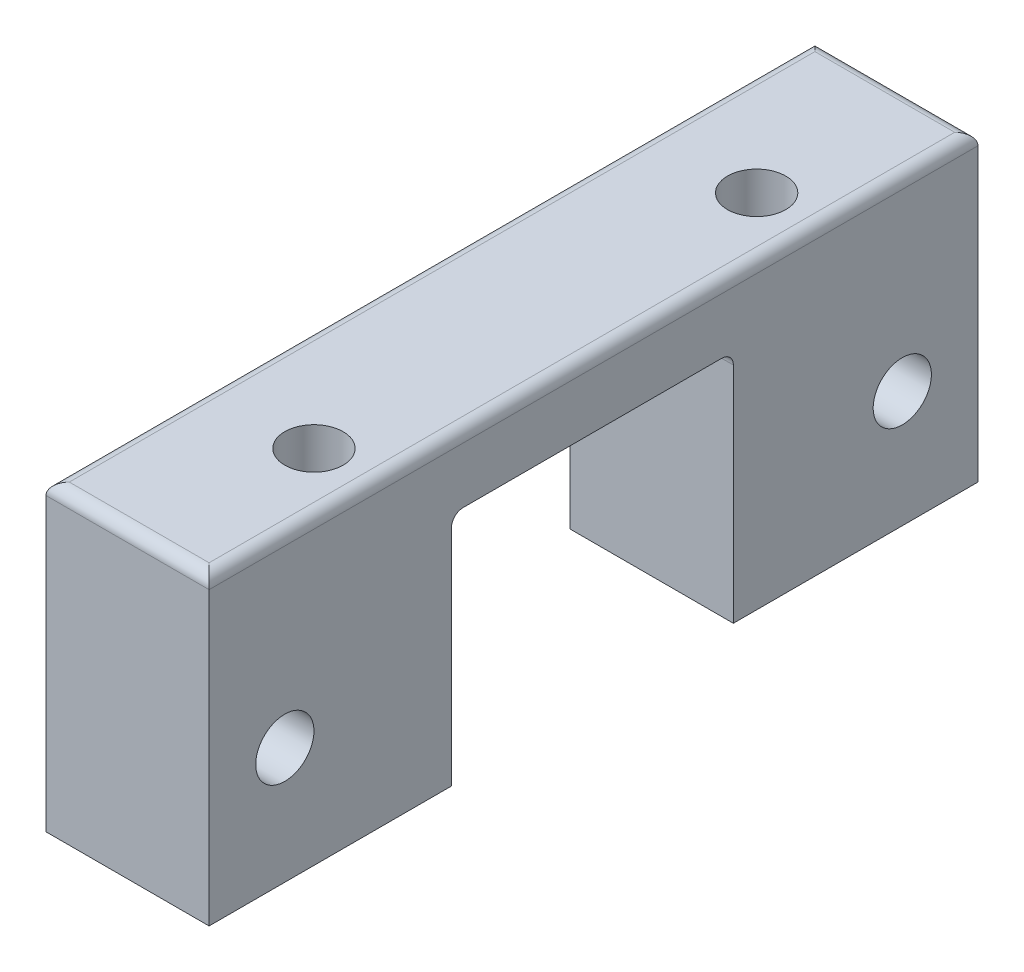
ISO-10303-21;
HEADER;
FILE_DESCRIPTION(('STEP AP214'),'2;1');
FILE_NAME('part.step','',(''),(''),'','','');
FILE_SCHEMA(('AUTOMOTIVE_DESIGN { 1 0 10303 214 1 1 1 1 }'));
ENDSEC;
DATA;
#1=APPLICATION_CONTEXT('core data for automotive mechanical design processes');
#2=APPLICATION_PROTOCOL_DEFINITION('international standard','automotive_design',2000,#1);
#3=PRODUCT_CONTEXT('',#1,'mechanical');
#4=PRODUCT('Part','Part','',(#3));
#5=PRODUCT_RELATED_PRODUCT_CATEGORY('part','',(#4));
#6=PRODUCT_DEFINITION_FORMATION('','',#4);
#7=PRODUCT_DEFINITION_CONTEXT('part definition',#1,'design');
#8=PRODUCT_DEFINITION('design','',#6,#7);
#9=PRODUCT_DEFINITION_SHAPE('','',#8);
#10=(LENGTH_UNIT() NAMED_UNIT(*) SI_UNIT(.MILLI.,.METRE.));
#11=(NAMED_UNIT(*) PLANE_ANGLE_UNIT() SI_UNIT($,.RADIAN.));
#12=(NAMED_UNIT(*) SI_UNIT($,.STERADIAN.) SOLID_ANGLE_UNIT());
#13=UNCERTAINTY_MEASURE_WITH_UNIT(LENGTH_MEASURE(1.E-05),#10,'distance_accuracy_value','');
#14=(GEOMETRIC_REPRESENTATION_CONTEXT(3) GLOBAL_UNCERTAINTY_ASSIGNED_CONTEXT((#13)) GLOBAL_UNIT_ASSIGNED_CONTEXT((#10,
#11,#12)) REPRESENTATION_CONTEXT('',''));
#15=CARTESIAN_POINT('',(0.,0.,0.));
#16=DIRECTION('',(0.,0.,1.));
#17=DIRECTION('',(1.,0.,0.));
#18=AXIS2_PLACEMENT_3D('',#15,#16,#17);
#19=CARTESIAN_POINT('',(0.,0.,0.));
#20=DIRECTION('',(0.,1.,0.));
#21=DIRECTION('',(0.,0.,1.));
#22=AXIS2_PLACEMENT_3D('',#19,#20,#21);
#23=PLANE('',#22);
#24=CARTESIAN_POINT('',(1.,0.,-9.5));
#25=DIRECTION('',(0.,1.,0.));
#26=DIRECTION('',(0.,0.,1.));
#27=AXIS2_PLACEMENT_3D('',#24,#25,#26);
#28=CIRCLE('',#27,1.25);
#29=CARTESIAN_POINT('',(1.,0.,-8.25));
#30=VERTEX_POINT('',#29);
#31=EDGE_CURVE('E200',#30,#30,#28,.T.);
#32=ORIENTED_EDGE('',*,*,#31,.T.);
#33=EDGE_LOOP('',(#32));
#34=FACE_BOUND('',#33,.T.);
#35=DIRECTION('',(0.,0.,-1.));
#36=VECTOR('',#35,1.);
#37=CARTESIAN_POINT('',(3.5,0.,16.5));
#38=LINE('',#37,#36);
#39=CARTESIAN_POINT('',(3.5,0.,-5.99999999999999));
#40=VERTEX_POINT('',#39);
#41=CARTESIAN_POINT('',(3.5,0.,-16.5));
#42=VERTEX_POINT('',#41);
#43=EDGE_CURVE('E131',#40,#42,#38,.T.);
#44=ORIENTED_EDGE('',*,*,#43,.F.);
#45=DIRECTION('',(-1.,0.,0.));
#46=VECTOR('',#45,1.);
#47=CARTESIAN_POINT('',(3.5,0.,-5.99999999999999));
#48=LINE('',#47,#46);
#49=CARTESIAN_POINT('',(-3.5,0.,-5.99999999999999));
#50=VERTEX_POINT('',#49);
#51=EDGE_CURVE('E143',#40,#50,#48,.T.);
#52=ORIENTED_EDGE('',*,*,#51,.T.);
#53=DIRECTION('',(0.,0.,-1.));
#54=VECTOR('',#53,1.);
#55=CARTESIAN_POINT('',(-3.5,0.,16.5));
#56=LINE('',#55,#54);
#57=CARTESIAN_POINT('',(-3.5,0.,-16.5));
#58=VERTEX_POINT('',#57);
#59=EDGE_CURVE('E165',#50,#58,#56,.T.);
#60=ORIENTED_EDGE('',*,*,#59,.T.);
#61=DIRECTION('',(1.,0.,0.));
#62=VECTOR('',#61,1.);
#63=CARTESIAN_POINT('',(-3.5,0.,-16.5));
#64=LINE('',#63,#62);
#65=EDGE_CURVE('E154',#58,#42,#64,.T.);
#66=ORIENTED_EDGE('',*,*,#65,.T.);
#67=EDGE_LOOP('',(#44,#52,#60,#66));
#68=FACE_BOUND('',#67,.T.);
#69=ADVANCED_FACE('F39',(#34,#68),#23,.F.);
#70=CARTESIAN_POINT('',(0.,13.,0.));
#71=DIRECTION('',(0.,1.,0.));
#72=DIRECTION('',(0.,0.,1.));
#73=AXIS2_PLACEMENT_3D('',#70,#71,#72);
#74=PLANE('',#73);
#75=CARTESIAN_POINT('',(1.,13.,9.5));
#76=DIRECTION('',(0.,-1.,0.));
#77=DIRECTION('',(0.,0.,-1.));
#78=AXIS2_PLACEMENT_3D('',#75,#76,#77);
#79=CIRCLE('',#78,1.25);
#80=CARTESIAN_POINT('',(1.,13.,10.75));
#81=VERTEX_POINT('',#80);
#82=EDGE_CURVE('E269',#81,#81,#79,.T.);
#83=ORIENTED_EDGE('',*,*,#82,.T.);
#84=EDGE_LOOP('',(#83));
#85=FACE_BOUND('',#84,.T.);
#86=DIRECTION('',(1.,0.,0.));
#87=VECTOR('',#86,1.);
#88=CARTESIAN_POINT('',(3.5,13.,16.));
#89=LINE('',#88,#87);
#90=CARTESIAN_POINT('',(-3.,13.,16.));
#91=VERTEX_POINT('',#90);
#92=CARTESIAN_POINT('',(3.,13.,16.));
#93=VERTEX_POINT('',#92);
#94=EDGE_CURVE('E182',#91,#93,#89,.T.);
#95=ORIENTED_EDGE('',*,*,#94,.T.);
#96=DIRECTION('',(0.,0.,-1.));
#97=VECTOR('',#96,1.);
#98=CARTESIAN_POINT('',(3.,13.,-16.5));
#99=LINE('',#98,#97);
#100=CARTESIAN_POINT('',(3.,13.,-16.));
#101=VERTEX_POINT('',#100);
#102=EDGE_CURVE('E185',#93,#101,#99,.T.);
#103=ORIENTED_EDGE('',*,*,#102,.T.);
#104=DIRECTION('',(1.,0.,0.));
#105=VECTOR('',#104,1.);
#106=CARTESIAN_POINT('',(0.,13.,-16.));
#107=LINE('',#106,#105);
#108=CARTESIAN_POINT('',(-3.,13.,-16.));
#109=VERTEX_POINT('',#108);
#110=EDGE_CURVE('E180',#101,#109,#107,.F.);
#111=ORIENTED_EDGE('',*,*,#110,.T.);
#112=DIRECTION('',(0.,0.,-1.));
#113=VECTOR('',#112,1.);
#114=CARTESIAN_POINT('',(-3.,13.,0.));
#115=LINE('',#114,#113);
#116=EDGE_CURVE('E173',#109,#91,#115,.F.);
#117=ORIENTED_EDGE('',*,*,#116,.T.);
#118=EDGE_LOOP('',(#95,#103,#111,#117));
#119=FACE_BOUND('',#118,.T.);
#120=CARTESIAN_POINT('',(1.,13.,-9.5));
#121=DIRECTION('',(0.,1.,0.));
#122=DIRECTION('',(0.,0.,1.));
#123=AXIS2_PLACEMENT_3D('',#120,#121,#122);
#124=CIRCLE('',#123,1.25);
#125=CARTESIAN_POINT('',(1.,13.,-8.25));
#126=VERTEX_POINT('',#125);
#127=EDGE_CURVE('E271',#126,#126,#124,.T.);
#128=ORIENTED_EDGE('',*,*,#127,.F.);
#129=EDGE_LOOP('',(#128));
#130=FACE_BOUND('',#129,.T.);
#131=ADVANCED_FACE('F240',(#85,#119,#130),#74,.T.);
#132=CARTESIAN_POINT('',(-3.5,0.,16.5));
#133=VERTEX_POINT('',#132);
#134=CARTESIAN_POINT('',(-3.5,0.,6.10000000000001));
#135=VERTEX_POINT('',#134);
#136=EDGE_CURVE('E166',#133,#135,#56,.T.);
#137=ORIENTED_EDGE('',*,*,#136,.T.);
#138=DIRECTION('',(-1.,0.,0.));
#139=VECTOR('',#138,1.);
#140=CARTESIAN_POINT('',(3.5,0.,6.10000000000001));
#141=LINE('',#140,#139);
#142=CARTESIAN_POINT('',(3.5,0.,6.10000000000001));
#143=VERTEX_POINT('',#142);
#144=EDGE_CURVE('E149',#143,#135,#141,.T.);
#145=ORIENTED_EDGE('',*,*,#144,.F.);
#146=CARTESIAN_POINT('',(3.5,0.,16.5));
#147=VERTEX_POINT('',#146);
#148=EDGE_CURVE('E155',#147,#143,#38,.T.);
#149=ORIENTED_EDGE('',*,*,#148,.F.);
#150=DIRECTION('',(1.,0.,0.));
#151=VECTOR('',#150,1.);
#152=CARTESIAN_POINT('',(-3.5,0.,16.5));
#153=LINE('',#152,#151);
#154=EDGE_CURVE('E158',#133,#147,#153,.T.);
#155=ORIENTED_EDGE('',*,*,#154,.F.);
#156=EDGE_LOOP('',(#137,#145,#149,#155));
#157=FACE_BOUND('',#156,.T.);
#158=CARTESIAN_POINT('',(1.,0.,9.5));
#159=DIRECTION('',(0.,-1.,0.));
#160=DIRECTION('',(0.,0.,-1.));
#161=AXIS2_PLACEMENT_3D('',#158,#159,#160);
#162=CIRCLE('',#161,1.25);
#163=CARTESIAN_POINT('',(1.,0.,10.75));
#164=VERTEX_POINT('',#163);
#165=EDGE_CURVE('E267',#164,#164,#162,.T.);
#166=ORIENTED_EDGE('',*,*,#165,.F.);
#167=EDGE_LOOP('',(#166));
#168=FACE_BOUND('',#167,.T.);
#169=ADVANCED_FACE('F243',(#157,#168),#23,.F.);
#170=CARTESIAN_POINT('',(-3.5,13.,-16.5));
#171=DIRECTION('',(0.,0.,-1.));
#172=DIRECTION('',(-1.,0.,0.));
#173=AXIS2_PLACEMENT_3D('',#170,#171,#172);
#174=PLANE('',#173);
#175=DIRECTION('',(0.,-1.,0.));
#176=VECTOR('',#175,1.);
#177=CARTESIAN_POINT('',(-3.5,13.,-16.5));
#178=LINE('',#177,#176);
#179=CARTESIAN_POINT('',(-3.5,12.5,-16.5));
#180=VERTEX_POINT('',#179);
#181=EDGE_CURVE('E170',#180,#58,#178,.T.);
#182=ORIENTED_EDGE('',*,*,#181,.F.);
#183=DIRECTION('',(1.,0.,0.));
#184=VECTOR('',#183,1.);
#185=CARTESIAN_POINT('',(-3.5,12.5,-16.5));
#186=LINE('',#185,#184);
#187=CARTESIAN_POINT('',(3.5,12.5,-16.5));
#188=VERTEX_POINT('',#187);
#189=EDGE_CURVE('E190',#180,#188,#186,.T.);
#190=ORIENTED_EDGE('',*,*,#189,.T.);
#191=DIRECTION('',(0.,-1.,0.));
#192=VECTOR('',#191,1.);
#193=CARTESIAN_POINT('',(3.5,13.,-16.5));
#194=LINE('',#193,#192);
#195=EDGE_CURVE('E169',#188,#42,#194,.T.);
#196=ORIENTED_EDGE('',*,*,#195,.T.);
#197=ORIENTED_EDGE('',*,*,#65,.F.);
#198=EDGE_LOOP('',(#182,#190,#196,#197));
#199=FACE_BOUND('',#198,.T.);
#200=ADVANCED_FACE('F253',(#199),#174,.T.);
#201=CARTESIAN_POINT('',(-3.5,13.,16.5));
#202=DIRECTION('',(-1.,0.,0.));
#203=DIRECTION('',(0.,0.,1.));
#204=AXIS2_PLACEMENT_3D('',#201,#202,#203);
#205=PLANE('',#204);
#206=CARTESIAN_POINT('',(-3.5,5.,13.25));
#207=DIRECTION('',(-1.,0.,0.));
#208=DIRECTION('',(0.,0.,-1.));
#209=AXIS2_PLACEMENT_3D('',#206,#207,#208);
#210=CIRCLE('',#209,1.25);
#211=CARTESIAN_POINT('',(-3.5,5.,12.));
#212=VERTEX_POINT('',#211);
#213=EDGE_CURVE('E286',#212,#212,#210,.T.);
#214=ORIENTED_EDGE('',*,*,#213,.F.);
#215=EDGE_LOOP('',(#214));
#216=FACE_BOUND('',#215,.T.);
#217=CARTESIAN_POINT('',(-3.5,5.,-13.25));
#218=DIRECTION('',(-1.,0.,0.));
#219=DIRECTION('',(0.,0.,1.));
#220=AXIS2_PLACEMENT_3D('',#217,#218,#219);
#221=CIRCLE('',#220,1.25);
#222=CARTESIAN_POINT('',(-3.5,5.,-12.));
#223=VERTEX_POINT('',#222);
#224=EDGE_CURVE('E280',#223,#223,#221,.T.);
#225=ORIENTED_EDGE('',*,*,#224,.F.);
#226=EDGE_LOOP('',(#225));
#227=FACE_BOUND('',#226,.T.);
#228=DIRECTION('',(0.,-1.,0.));
#229=VECTOR('',#228,1.);
#230=CARTESIAN_POINT('',(-3.5,0.,-5.99999999999999));
#231=LINE('',#230,#229);
#232=CARTESIAN_POINT('',(-3.5,9.6,-5.99999999999999));
#233=VERTEX_POINT('',#232);
#234=EDGE_CURVE('E146',#233,#50,#231,.T.);
#235=ORIENTED_EDGE('',*,*,#234,.F.);
#236=CARTESIAN_POINT('',(-3.5,9.6,-5.49999999999999));
#237=DIRECTION('',(-1.,0.,0.));
#238=DIRECTION('',(0.,0.,1.));
#239=AXIS2_PLACEMENT_3D('',#236,#237,#238);
#240=CIRCLE('',#239,0.5);
#241=CARTESIAN_POINT('',(-3.5,10.1,-5.49999999999999));
#242=VERTEX_POINT('',#241);
#243=EDGE_CURVE('E214',#233,#242,#240,.F.);
#244=ORIENTED_EDGE('',*,*,#243,.T.);
#245=DIRECTION('',(0.,0.,-1.));
#246=VECTOR('',#245,1.);
#247=CARTESIAN_POINT('',(-3.5,10.1,-5.99999999999999));
#248=LINE('',#247,#246);
#249=CARTESIAN_POINT('',(-3.5,10.1,5.60000000000001));
#250=VERTEX_POINT('',#249);
#251=EDGE_CURVE('E140',#250,#242,#248,.T.);
#252=ORIENTED_EDGE('',*,*,#251,.F.);
#253=CARTESIAN_POINT('',(-3.5,9.6,5.60000000000001));
#254=DIRECTION('',(-1.,0.,0.));
#255=DIRECTION('',(0.,0.,1.));
#256=AXIS2_PLACEMENT_3D('',#253,#254,#255);
#257=CIRCLE('',#256,0.5);
#258=CARTESIAN_POINT('',(-3.5,9.6,6.10000000000001));
#259=VERTEX_POINT('',#258);
#260=EDGE_CURVE('E47',#250,#259,#257,.F.);
#261=ORIENTED_EDGE('',*,*,#260,.T.);
#262=DIRECTION('',(0.,1.,0.));
#263=VECTOR('',#262,1.);
#264=CARTESIAN_POINT('',(-3.5,0.,6.10000000000001));
#265=LINE('',#264,#263);
#266=EDGE_CURVE('E224',#135,#259,#265,.T.);
#267=ORIENTED_EDGE('',*,*,#266,.F.);
#268=ORIENTED_EDGE('',*,*,#136,.F.);
#269=DIRECTION('',(0.,-1.,0.));
#270=VECTOR('',#269,1.);
#271=CARTESIAN_POINT('',(-3.5,13.,16.5));
#272=LINE('',#271,#270);
#273=CARTESIAN_POINT('',(-3.5,12.5,16.5));
#274=VERTEX_POINT('',#273);
#275=EDGE_CURVE('E174',#274,#133,#272,.T.);
#276=ORIENTED_EDGE('',*,*,#275,.F.);
#277=DIRECTION('',(0.,0.,-1.));
#278=VECTOR('',#277,1.);
#279=CARTESIAN_POINT('',(-3.5,12.5,16.5));
#280=LINE('',#279,#278);
#281=EDGE_CURVE('E194',#274,#180,#280,.T.);
#282=ORIENTED_EDGE('',*,*,#281,.T.);
#283=ORIENTED_EDGE('',*,*,#181,.T.);
#284=ORIENTED_EDGE('',*,*,#59,.F.);
#285=EDGE_LOOP('',(#235,#244,#252,#261,#267,#268,#276,#282,#283,#284));
#286=FACE_BOUND('',#285,.T.);
#287=ADVANCED_FACE('F217',(#216,#227,#286),#205,.T.);
#288=CARTESIAN_POINT('',(-3.5,13.,16.5));
#289=DIRECTION('',(0.,0.,-1.));
#290=DIRECTION('',(-1.,0.,0.));
#291=AXIS2_PLACEMENT_3D('',#288,#289,#290);
#292=PLANE('',#291);
#293=DIRECTION('',(0.,-1.,0.));
#294=VECTOR('',#293,1.);
#295=CARTESIAN_POINT('',(3.5,13.,16.5));
#296=LINE('',#295,#294);
#297=CARTESIAN_POINT('',(3.5,12.5,16.5));
#298=VERTEX_POINT('',#297);
#299=EDGE_CURVE('E176',#298,#147,#296,.T.);
#300=ORIENTED_EDGE('',*,*,#299,.F.);
#301=DIRECTION('',(1.,0.,0.));
#302=VECTOR('',#301,1.);
#303=CARTESIAN_POINT('',(-3.5,12.5,16.5));
#304=LINE('',#303,#302);
#305=EDGE_CURVE('E187',#298,#274,#304,.F.);
#306=ORIENTED_EDGE('',*,*,#305,.T.);
#307=ORIENTED_EDGE('',*,*,#275,.T.);
#308=ORIENTED_EDGE('',*,*,#154,.T.);
#309=EDGE_LOOP('',(#300,#306,#307,#308));
#310=FACE_BOUND('',#309,.T.);
#311=ADVANCED_FACE('F297',(#310),#292,.F.);
#312=CARTESIAN_POINT('',(3.5,13.,16.5));
#313=DIRECTION('',(-1.,0.,0.));
#314=DIRECTION('',(0.,0.,1.));
#315=AXIS2_PLACEMENT_3D('',#312,#313,#314);
#316=PLANE('',#315);
#317=CARTESIAN_POINT('',(3.5,5.,13.25));
#318=DIRECTION('',(-1.,0.,0.));
#319=DIRECTION('',(0.,0.,-1.));
#320=AXIS2_PLACEMENT_3D('',#317,#318,#319);
#321=CIRCLE('',#320,1.25);
#322=CARTESIAN_POINT('',(3.5,5.,12.));
#323=VERTEX_POINT('',#322);
#324=EDGE_CURVE('E283',#323,#323,#321,.T.);
#325=ORIENTED_EDGE('',*,*,#324,.T.);
#326=EDGE_LOOP('',(#325));
#327=FACE_BOUND('',#326,.T.);
#328=CARTESIAN_POINT('',(3.5,5.,-13.25));
#329=DIRECTION('',(-1.,0.,0.));
#330=DIRECTION('',(0.,0.,1.));
#331=AXIS2_PLACEMENT_3D('',#328,#329,#330);
#332=CIRCLE('',#331,1.25);
#333=CARTESIAN_POINT('',(3.5,5.,-12.));
#334=VERTEX_POINT('',#333);
#335=EDGE_CURVE('E289',#334,#334,#332,.T.);
#336=ORIENTED_EDGE('',*,*,#335,.T.);
#337=EDGE_LOOP('',(#336));
#338=FACE_BOUND('',#337,.T.);
#339=DIRECTION('',(0.,1.,0.));
#340=VECTOR('',#339,1.);
#341=CARTESIAN_POINT('',(3.5,0.,6.10000000000001));
#342=LINE('',#341,#340);
#343=CARTESIAN_POINT('',(3.5,9.6,6.10000000000001));
#344=VERTEX_POINT('',#343);
#345=EDGE_CURVE('E139',#143,#344,#342,.T.);
#346=ORIENTED_EDGE('',*,*,#345,.T.);
#347=CARTESIAN_POINT('',(3.5,9.6,5.60000000000001));
#348=DIRECTION('',(-1.,0.,0.));
#349=DIRECTION('',(0.,0.,1.));
#350=AXIS2_PLACEMENT_3D('',#347,#348,#349);
#351=CIRCLE('',#350,0.5);
#352=CARTESIAN_POINT('',(3.5,10.1,5.60000000000001));
#353=VERTEX_POINT('',#352);
#354=EDGE_CURVE('E11',#344,#353,#351,.T.);
#355=ORIENTED_EDGE('',*,*,#354,.T.);
#356=DIRECTION('',(0.,0.,-1.));
#357=VECTOR('',#356,1.);
#358=CARTESIAN_POINT('',(3.5,10.1,-5.99999999999999));
#359=LINE('',#358,#357);
#360=CARTESIAN_POINT('',(3.5,10.1,-5.49999999999999));
#361=VERTEX_POINT('',#360);
#362=EDGE_CURVE('E150',#353,#361,#359,.T.);
#363=ORIENTED_EDGE('',*,*,#362,.T.);
#364=CARTESIAN_POINT('',(3.5,9.6,-5.49999999999999));
#365=DIRECTION('',(-1.,0.,0.));
#366=DIRECTION('',(0.,0.,1.));
#367=AXIS2_PLACEMENT_3D('',#364,#365,#366);
#368=CIRCLE('',#367,0.5);
#369=CARTESIAN_POINT('',(3.5,9.6,-5.99999999999999));
#370=VERTEX_POINT('',#369);
#371=EDGE_CURVE('E135',#361,#370,#368,.T.);
#372=ORIENTED_EDGE('',*,*,#371,.T.);
#373=DIRECTION('',(0.,-1.,0.));
#374=VECTOR('',#373,1.);
#375=CARTESIAN_POINT('',(3.5,0.,-5.99999999999999));
#376=LINE('',#375,#374);
#377=EDGE_CURVE('E126',#370,#40,#376,.T.);
#378=ORIENTED_EDGE('',*,*,#377,.T.);
#379=ORIENTED_EDGE('',*,*,#43,.T.);
#380=ORIENTED_EDGE('',*,*,#195,.F.);
#381=DIRECTION('',(0.,0.,-1.));
#382=VECTOR('',#381,1.);
#383=CARTESIAN_POINT('',(3.5,12.5,16.5));
#384=LINE('',#383,#382);
#385=EDGE_CURVE('E192',#188,#298,#384,.F.);
#386=ORIENTED_EDGE('',*,*,#385,.T.);
#387=ORIENTED_EDGE('',*,*,#299,.T.);
#388=ORIENTED_EDGE('',*,*,#148,.T.);
#389=EDGE_LOOP('',(#346,#355,#363,#372,#378,#379,#380,#386,#387,#388));
#390=FACE_BOUND('',#389,.T.);
#391=ADVANCED_FACE('F128',(#327,#338,#390),#316,.F.);
#392=CARTESIAN_POINT('',(-3.5,12.5,-16.));
#393=DIRECTION('',(1.,0.,0.));
#394=DIRECTION('',(0.,0.,-1.));
#395=AXIS2_PLACEMENT_3D('',#392,#393,#394);
#396=CYLINDRICAL_SURFACE('',#395,0.5);
#397=CARTESIAN_POINT('',(3.,12.5,-16.));
#398=DIRECTION('',(0.707106781186547,0.,0.707106781186547));
#399=DIRECTION('',(-0.707106781186547,0.,0.707106781186547));
#400=AXIS2_PLACEMENT_3D('',#397,#398,#399);
#401=ELLIPSE('',#400,0.707106781186547,0.5);
#402=EDGE_CURVE('E202',#188,#101,#401,.T.);
#403=ORIENTED_EDGE('',*,*,#402,.F.);
#404=ORIENTED_EDGE('',*,*,#189,.F.);
#405=CARTESIAN_POINT('',(-3.,12.5,-16.));
#406=DIRECTION('',(0.707106781186547,0.,-0.707106781186547));
#407=DIRECTION('',(-0.707106781186547,0.,-0.707106781186547));
#408=AXIS2_PLACEMENT_3D('',#405,#406,#407);
#409=ELLIPSE('',#408,0.707106781186547,0.5);
#410=EDGE_CURVE('E159',#109,#180,#409,.F.);
#411=ORIENTED_EDGE('',*,*,#410,.F.);
#412=ORIENTED_EDGE('',*,*,#110,.F.);
#413=EDGE_LOOP('',(#403,#404,#411,#412));
#414=FACE_BOUND('',#413,.T.);
#415=ADVANCED_FACE('F307',(#414),#396,.T.);
#416=CARTESIAN_POINT('',(-3.,12.5,16.5));
#417=DIRECTION('',(0.,0.,-1.));
#418=DIRECTION('',(-1.,0.,0.));
#419=AXIS2_PLACEMENT_3D('',#416,#417,#418);
#420=CYLINDRICAL_SURFACE('',#419,0.5);
#421=ORIENTED_EDGE('',*,*,#410,.T.);
#422=ORIENTED_EDGE('',*,*,#281,.F.);
#423=CARTESIAN_POINT('',(-3.,12.5,16.));
#424=DIRECTION('',(-0.707106781186547,0.,-0.707106781186547));
#425=DIRECTION('',(0.707106781186547,0.,-0.707106781186547));
#426=AXIS2_PLACEMENT_3D('',#423,#424,#425);
#427=ELLIPSE('',#426,0.707106781186547,0.5);
#428=EDGE_CURVE('E199',#91,#274,#427,.F.);
#429=ORIENTED_EDGE('',*,*,#428,.F.);
#430=ORIENTED_EDGE('',*,*,#116,.F.);
#431=EDGE_LOOP('',(#421,#422,#429,#430));
#432=FACE_BOUND('',#431,.T.);
#433=ADVANCED_FACE('F318',(#432),#420,.T.);
#434=CARTESIAN_POINT('',(3.,12.5,0.));
#435=DIRECTION('',(0.,0.,1.));
#436=DIRECTION('',(1.,0.,0.));
#437=AXIS2_PLACEMENT_3D('',#434,#435,#436);
#438=CYLINDRICAL_SURFACE('',#437,0.5);
#439=ORIENTED_EDGE('',*,*,#402,.T.);
#440=ORIENTED_EDGE('',*,*,#102,.F.);
#441=CARTESIAN_POINT('',(3.,12.5,16.));
#442=DIRECTION('',(-0.707106781186547,0.,0.707106781186547));
#443=DIRECTION('',(0.707106781186547,0.,0.707106781186547));
#444=AXIS2_PLACEMENT_3D('',#441,#442,#443);
#445=ELLIPSE('',#444,0.707106781186547,0.5);
#446=EDGE_CURVE('E197',#298,#93,#445,.T.);
#447=ORIENTED_EDGE('',*,*,#446,.F.);
#448=ORIENTED_EDGE('',*,*,#385,.F.);
#449=EDGE_LOOP('',(#439,#440,#447,#448));
#450=FACE_BOUND('',#449,.T.);
#451=ADVANCED_FACE('F314',(#450),#438,.T.);
#452=CARTESIAN_POINT('',(0.,12.5,16.));
#453=DIRECTION('',(-1.,0.,0.));
#454=DIRECTION('',(0.,0.,1.));
#455=AXIS2_PLACEMENT_3D('',#452,#453,#454);
#456=CYLINDRICAL_SURFACE('',#455,0.5);
#457=ORIENTED_EDGE('',*,*,#428,.T.);
#458=ORIENTED_EDGE('',*,*,#305,.F.);
#459=ORIENTED_EDGE('',*,*,#446,.T.);
#460=ORIENTED_EDGE('',*,*,#94,.F.);
#461=EDGE_LOOP('',(#457,#458,#459,#460));
#462=FACE_BOUND('',#461,.T.);
#463=ADVANCED_FACE('F310',(#462),#456,.T.);
#464=CARTESIAN_POINT('',(1.,0.,9.5));
#465=DIRECTION('',(0.,1.,0.));
#466=DIRECTION('',(0.,0.,1.));
#467=AXIS2_PLACEMENT_3D('',#464,#465,#466);
#468=CYLINDRICAL_SURFACE('',#467,1.25);
#469=CARTESIAN_POINT('',(1.,0.,10.75));
#470=CARTESIAN_POINT('',(1.,0.135416666666666,10.75));
#471=CARTESIAN_POINT('',(1.,0.270833333333333,10.75));
#472=CARTESIAN_POINT('',(1.,0.541666666666667,10.75));
#473=CARTESIAN_POINT('',(1.,0.677083333333333,10.75));
#474=CARTESIAN_POINT('',(1.,0.947916666666667,10.75));
#475=CARTESIAN_POINT('',(1.,1.08333333333333,10.75));
#476=CARTESIAN_POINT('',(1.,1.35416666666667,10.75));
#477=CARTESIAN_POINT('',(1.,1.48958333333333,10.75));
#478=CARTESIAN_POINT('',(1.,1.76041666666667,10.75));
#479=CARTESIAN_POINT('',(1.,1.89583333333333,10.75));
#480=CARTESIAN_POINT('',(1.,2.16666666666667,10.75));
#481=CARTESIAN_POINT('',(1.,2.30208333333333,10.75));
#482=CARTESIAN_POINT('',(1.,2.57291666666667,10.75));
#483=CARTESIAN_POINT('',(1.,2.70833333333333,10.75));
#484=CARTESIAN_POINT('',(1.,2.97916666666667,10.75));
#485=CARTESIAN_POINT('',(1.,3.11458333333333,10.75));
#486=CARTESIAN_POINT('',(1.,3.38541666666667,10.75));
#487=CARTESIAN_POINT('',(1.,3.52083333333333,10.75));
#488=CARTESIAN_POINT('',(1.,3.79166666666667,10.75));
#489=CARTESIAN_POINT('',(1.,3.92708333333333,10.75));
#490=CARTESIAN_POINT('',(1.,4.19791666666667,10.75));
#491=CARTESIAN_POINT('',(1.,4.33333333333333,10.75));
#492=CARTESIAN_POINT('',(1.,4.60416666666667,10.75));
#493=CARTESIAN_POINT('',(1.,4.73958333333333,10.75));
#494=CARTESIAN_POINT('',(1.,5.01041666666667,10.75));
#495=CARTESIAN_POINT('',(1.,5.14583333333333,10.75));
#496=CARTESIAN_POINT('',(1.,5.41666666666667,10.75));
#497=CARTESIAN_POINT('',(1.,5.55208333333333,10.75));
#498=CARTESIAN_POINT('',(1.,5.82291666666667,10.75));
#499=CARTESIAN_POINT('',(1.,5.95833333333333,10.75));
#500=CARTESIAN_POINT('',(1.,6.22916666666667,10.75));
#501=CARTESIAN_POINT('',(1.,6.36458333333333,10.75));
#502=CARTESIAN_POINT('',(1.,6.63541666666667,10.75));
#503=CARTESIAN_POINT('',(1.,6.77083333333333,10.75));
#504=CARTESIAN_POINT('',(1.,7.04166666666667,10.75));
#505=CARTESIAN_POINT('',(1.,7.17708333333333,10.75));
#506=CARTESIAN_POINT('',(1.,7.44791666666667,10.75));
#507=CARTESIAN_POINT('',(1.,7.58333333333333,10.75));
#508=CARTESIAN_POINT('',(1.,7.85416666666667,10.75));
#509=CARTESIAN_POINT('',(1.,7.98958333333333,10.75));
#510=CARTESIAN_POINT('',(1.,8.26041666666667,10.75));
#511=CARTESIAN_POINT('',(1.,8.39583333333333,10.75));
#512=CARTESIAN_POINT('',(1.,8.66666666666667,10.75));
#513=CARTESIAN_POINT('',(1.,8.80208333333333,10.75));
#514=CARTESIAN_POINT('',(1.,9.07291666666667,10.75));
#515=CARTESIAN_POINT('',(1.,9.20833333333333,10.75));
#516=CARTESIAN_POINT('',(1.,9.47916666666667,10.75));
#517=CARTESIAN_POINT('',(1.,9.61458333333333,10.75));
#518=CARTESIAN_POINT('',(1.,9.88541666666667,10.75));
#519=CARTESIAN_POINT('',(1.,10.0208333333333,10.75));
#520=CARTESIAN_POINT('',(1.,10.2916666666667,10.75));
#521=CARTESIAN_POINT('',(1.,10.4270833333333,10.75));
#522=CARTESIAN_POINT('',(1.,10.6979166666667,10.75));
#523=CARTESIAN_POINT('',(1.,10.8333333333333,10.75));
#524=CARTESIAN_POINT('',(1.,11.1041666666667,10.75));
#525=CARTESIAN_POINT('',(1.,11.2395833333333,10.75));
#526=CARTESIAN_POINT('',(1.,11.5104166666667,10.75));
#527=CARTESIAN_POINT('',(1.,11.6458333333333,10.75));
#528=CARTESIAN_POINT('',(1.,11.9166666666667,10.75));
#529=CARTESIAN_POINT('',(1.,12.0520833333333,10.75));
#530=CARTESIAN_POINT('',(1.,12.3229166666667,10.75));
#531=CARTESIAN_POINT('',(1.,12.4583333333333,10.75));
#532=CARTESIAN_POINT('',(1.,12.7291666666667,10.75));
#533=CARTESIAN_POINT('',(1.,12.8645833333333,10.75));
#534=CARTESIAN_POINT('',(1.,13.,10.75));
#535=B_SPLINE_CURVE_WITH_KNOTS('',3,(#469,#470,#471,#472,#473,#474,#475,#476,#477,#478,#479,
#480,#481,#482,#483,#484,#485,#486,#487,#488,#489,#490,#491,#492,#493,#494,#495,#496,#497,#498,
#499,#500,#501,#502,#503,#504,#505,#506,#507,#508,#509,#510,#511,#512,#513,#514,#515,#516,#517,
#518,#519,#520,#521,#522,#523,#524,#525,#526,#527,#528,#529,#530,#531,#532,#533,#534),
.UNSPECIFIED.,.F.,.F.,(4,2,2,2,2,2,2,2,2,2,2,2,2,2,2,2,2,2,2,2,2,2,2,2,2,2,2,2,2,2,2,2,4),(0.,
0.40625,0.8125,1.21875,1.625,2.03125,2.4375,2.84375,3.25,3.65625,4.0625,4.46875,4.875,5.28125,
5.6875,6.09375,6.5,6.90625,7.3125,7.71875,8.125,8.53125,8.9375,9.34375,9.75,10.15625,10.5625,
10.96875,11.375,11.78125,12.1875,12.59375,13.),.UNSPECIFIED.);
#536=EDGE_CURVE('BSEAM313',#164,#81,#535,.T.);
#537=ORIENTED_EDGE('',*,*,#165,.T.);
#538=ORIENTED_EDGE('',*,*,#82,.F.);
#539=ORIENTED_EDGE('',*,*,#536,.T.);
#540=ORIENTED_EDGE('',*,*,#536,.F.);
#541=EDGE_LOOP('',(#537,#539,#538,#540));
#542=FACE_BOUND('',#541,.T.);
#543=ADVANCED_FACE('F313',(#542),#468,.F.);
#544=CARTESIAN_POINT('',(1.,0.,-9.5));
#545=DIRECTION('',(0.,1.,0.));
#546=DIRECTION('',(0.,0.,1.));
#547=AXIS2_PLACEMENT_3D('',#544,#545,#546);
#548=CYLINDRICAL_SURFACE('',#547,1.25);
#549=CARTESIAN_POINT('',(1.,0.,-8.25));
#550=CARTESIAN_POINT('',(1.,0.135416666666666,-8.25));
#551=CARTESIAN_POINT('',(1.,0.270833333333333,-8.25));
#552=CARTESIAN_POINT('',(1.,0.541666666666667,-8.25));
#553=CARTESIAN_POINT('',(1.,0.677083333333333,-8.25));
#554=CARTESIAN_POINT('',(1.,0.947916666666667,-8.25));
#555=CARTESIAN_POINT('',(1.,1.08333333333333,-8.25));
#556=CARTESIAN_POINT('',(1.,1.35416666666667,-8.25));
#557=CARTESIAN_POINT('',(1.,1.48958333333333,-8.25));
#558=CARTESIAN_POINT('',(1.,1.76041666666667,-8.25));
#559=CARTESIAN_POINT('',(1.,1.89583333333333,-8.25));
#560=CARTESIAN_POINT('',(1.,2.16666666666667,-8.25));
#561=CARTESIAN_POINT('',(1.,2.30208333333333,-8.25));
#562=CARTESIAN_POINT('',(1.,2.57291666666667,-8.25));
#563=CARTESIAN_POINT('',(1.,2.70833333333333,-8.25));
#564=CARTESIAN_POINT('',(1.,2.97916666666667,-8.25));
#565=CARTESIAN_POINT('',(1.,3.11458333333333,-8.25));
#566=CARTESIAN_POINT('',(1.,3.38541666666667,-8.25));
#567=CARTESIAN_POINT('',(1.,3.52083333333333,-8.25));
#568=CARTESIAN_POINT('',(1.,3.79166666666667,-8.25));
#569=CARTESIAN_POINT('',(1.,3.92708333333333,-8.25));
#570=CARTESIAN_POINT('',(1.,4.19791666666667,-8.25));
#571=CARTESIAN_POINT('',(1.,4.33333333333333,-8.25));
#572=CARTESIAN_POINT('',(1.,4.60416666666667,-8.25));
#573=CARTESIAN_POINT('',(1.,4.73958333333333,-8.25));
#574=CARTESIAN_POINT('',(1.,5.01041666666667,-8.25));
#575=CARTESIAN_POINT('',(1.,5.14583333333333,-8.25));
#576=CARTESIAN_POINT('',(1.,5.41666666666667,-8.25));
#577=CARTESIAN_POINT('',(1.,5.55208333333333,-8.25));
#578=CARTESIAN_POINT('',(1.,5.82291666666667,-8.25));
#579=CARTESIAN_POINT('',(1.,5.95833333333333,-8.25));
#580=CARTESIAN_POINT('',(1.,6.22916666666667,-8.25));
#581=CARTESIAN_POINT('',(1.,6.36458333333333,-8.25));
#582=CARTESIAN_POINT('',(1.,6.63541666666667,-8.25));
#583=CARTESIAN_POINT('',(1.,6.77083333333333,-8.25));
#584=CARTESIAN_POINT('',(1.,7.04166666666667,-8.25));
#585=CARTESIAN_POINT('',(1.,7.17708333333333,-8.25));
#586=CARTESIAN_POINT('',(1.,7.44791666666667,-8.25));
#587=CARTESIAN_POINT('',(1.,7.58333333333333,-8.25));
#588=CARTESIAN_POINT('',(1.,7.85416666666667,-8.25));
#589=CARTESIAN_POINT('',(1.,7.98958333333333,-8.25));
#590=CARTESIAN_POINT('',(1.,8.26041666666667,-8.25));
#591=CARTESIAN_POINT('',(1.,8.39583333333333,-8.25));
#592=CARTESIAN_POINT('',(1.,8.66666666666667,-8.25));
#593=CARTESIAN_POINT('',(1.,8.80208333333333,-8.25));
#594=CARTESIAN_POINT('',(1.,9.07291666666667,-8.25));
#595=CARTESIAN_POINT('',(1.,9.20833333333333,-8.25));
#596=CARTESIAN_POINT('',(1.,9.47916666666667,-8.25));
#597=CARTESIAN_POINT('',(1.,9.61458333333333,-8.25));
#598=CARTESIAN_POINT('',(1.,9.88541666666667,-8.25));
#599=CARTESIAN_POINT('',(1.,10.0208333333333,-8.25));
#600=CARTESIAN_POINT('',(1.,10.2916666666667,-8.25));
#601=CARTESIAN_POINT('',(1.,10.4270833333333,-8.25));
#602=CARTESIAN_POINT('',(1.,10.6979166666667,-8.25));
#603=CARTESIAN_POINT('',(1.,10.8333333333333,-8.25));
#604=CARTESIAN_POINT('',(1.,11.1041666666667,-8.25));
#605=CARTESIAN_POINT('',(1.,11.2395833333333,-8.25));
#606=CARTESIAN_POINT('',(1.,11.5104166666667,-8.25));
#607=CARTESIAN_POINT('',(1.,11.6458333333333,-8.25));
#608=CARTESIAN_POINT('',(1.,11.9166666666667,-8.25));
#609=CARTESIAN_POINT('',(1.,12.0520833333333,-8.25));
#610=CARTESIAN_POINT('',(1.,12.3229166666667,-8.25));
#611=CARTESIAN_POINT('',(1.,12.4583333333333,-8.25));
#612=CARTESIAN_POINT('',(1.,12.7291666666667,-8.25));
#613=CARTESIAN_POINT('',(1.,12.8645833333333,-8.25));
#614=CARTESIAN_POINT('',(1.,13.,-8.25));
#615=B_SPLINE_CURVE_WITH_KNOTS('',3,(#549,#550,#551,#552,#553,#554,#555,#556,#557,#558,#559,
#560,#561,#562,#563,#564,#565,#566,#567,#568,#569,#570,#571,#572,#573,#574,#575,#576,#577,#578,
#579,#580,#581,#582,#583,#584,#585,#586,#587,#588,#589,#590,#591,#592,#593,#594,#595,#596,#597,
#598,#599,#600,#601,#602,#603,#604,#605,#606,#607,#608,#609,#610,#611,#612,#613,#614),
.UNSPECIFIED.,.F.,.F.,(4,2,2,2,2,2,2,2,2,2,2,2,2,2,2,2,2,2,2,2,2,2,2,2,2,2,2,2,2,2,2,2,4),(0.,
0.40625,0.8125,1.21875,1.625,2.03125,2.4375,2.84375,3.25,3.65625,4.0625,4.46875,4.875,5.28125,
5.6875,6.09375,6.5,6.90625,7.3125,7.71875,8.125,8.53125,8.9375,9.34375,9.75,10.15625,10.5625,
10.96875,11.375,11.78125,12.1875,12.59375,13.),.UNSPECIFIED.);
#616=EDGE_CURVE('BSEAM354',#30,#126,#615,.T.);
#617=ORIENTED_EDGE('',*,*,#31,.F.);
#618=ORIENTED_EDGE('',*,*,#127,.T.);
#619=ORIENTED_EDGE('',*,*,#616,.T.);
#620=ORIENTED_EDGE('',*,*,#616,.F.);
#621=EDGE_LOOP('',(#617,#619,#618,#620));
#622=FACE_BOUND('',#621,.T.);
#623=ADVANCED_FACE('F354',(#622),#548,.F.);
#624=CARTESIAN_POINT('',(3.5,0.,-5.99999999999999));
#625=DIRECTION('',(0.,0.,-1.));
#626=DIRECTION('',(0.,1.,0.));
#627=AXIS2_PLACEMENT_3D('',#624,#625,#626);
#628=PLANE('',#627);
#629=ORIENTED_EDGE('',*,*,#377,.F.);
#630=DIRECTION('',(-1.,0.,0.));
#631=VECTOR('',#630,1.);
#632=CARTESIAN_POINT('',(-3.5,9.6,-5.99999999999999));
#633=LINE('',#632,#631);
#634=EDGE_CURVE('E196',#370,#233,#633,.T.);
#635=ORIENTED_EDGE('',*,*,#634,.T.);
#636=ORIENTED_EDGE('',*,*,#234,.T.);
#637=ORIENTED_EDGE('',*,*,#51,.F.);
#638=EDGE_LOOP('',(#629,#635,#636,#637));
#639=FACE_BOUND('',#638,.T.);
#640=ADVANCED_FACE('F144',(#639),#628,.F.);
#641=CARTESIAN_POINT('',(3.5,10.1,-5.99999999999999));
#642=DIRECTION('',(0.,1.,0.));
#643=DIRECTION('',(0.,0.,1.));
#644=AXIS2_PLACEMENT_3D('',#641,#642,#643);
#645=PLANE('',#644);
#646=ORIENTED_EDGE('',*,*,#251,.T.);
#647=DIRECTION('',(-1.,0.,0.));
#648=VECTOR('',#647,1.);
#649=CARTESIAN_POINT('',(3.5,10.1,-5.49999999999999));
#650=LINE('',#649,#648);
#651=EDGE_CURVE('E211',#242,#361,#650,.F.);
#652=ORIENTED_EDGE('',*,*,#651,.T.);
#653=ORIENTED_EDGE('',*,*,#362,.F.);
#654=DIRECTION('',(-1.,0.,0.));
#655=VECTOR('',#654,1.);
#656=CARTESIAN_POINT('',(-3.5,10.1,5.60000000000001));
#657=LINE('',#656,#655);
#658=EDGE_CURVE('E208',#353,#250,#657,.T.);
#659=ORIENTED_EDGE('',*,*,#658,.T.);
#660=EDGE_LOOP('',(#646,#652,#653,#659));
#661=FACE_BOUND('',#660,.T.);
#662=ADVANCED_FACE('F221',(#661),#645,.F.);
#663=CARTESIAN_POINT('',(3.5,0.,6.10000000000001));
#664=DIRECTION('',(0.,0.,1.));
#665=DIRECTION('',(1.,0.,0.));
#666=AXIS2_PLACEMENT_3D('',#663,#664,#665);
#667=PLANE('',#666);
#668=ORIENTED_EDGE('',*,*,#266,.T.);
#669=DIRECTION('',(-1.,0.,0.));
#670=VECTOR('',#669,1.);
#671=CARTESIAN_POINT('',(3.5,9.6,6.10000000000001));
#672=LINE('',#671,#670);
#673=EDGE_CURVE('E54',#259,#344,#672,.F.);
#674=ORIENTED_EDGE('',*,*,#673,.T.);
#675=ORIENTED_EDGE('',*,*,#345,.F.);
#676=ORIENTED_EDGE('',*,*,#144,.T.);
#677=EDGE_LOOP('',(#668,#674,#675,#676));
#678=FACE_BOUND('',#677,.T.);
#679=ADVANCED_FACE('F343',(#678),#667,.F.);
#680=CARTESIAN_POINT('',(3.5,5.,-13.25));
#681=DIRECTION('',(-1.,0.,0.));
#682=DIRECTION('',(0.,0.,1.));
#683=AXIS2_PLACEMENT_3D('',#680,#681,#682);
#684=CYLINDRICAL_SURFACE('',#683,1.25);
#685=ORIENTED_EDGE('',*,*,#335,.F.);
#686=EDGE_LOOP('',(#685));
#687=FACE_BOUND('',#686,.T.);
#688=ORIENTED_EDGE('',*,*,#224,.T.);
#689=EDGE_LOOP('',(#688));
#690=FACE_BOUND('',#689,.T.);
#691=ADVANCED_FACE('F235',(#687,#690),#684,.F.);
#692=CARTESIAN_POINT('',(3.5,5.,13.25));
#693=DIRECTION('',(-1.,0.,0.));
#694=DIRECTION('',(0.,0.,1.));
#695=AXIS2_PLACEMENT_3D('',#692,#693,#694);
#696=CYLINDRICAL_SURFACE('',#695,1.25);
#697=ORIENTED_EDGE('',*,*,#324,.F.);
#698=EDGE_LOOP('',(#697));
#699=FACE_BOUND('',#698,.T.);
#700=ORIENTED_EDGE('',*,*,#213,.T.);
#701=EDGE_LOOP('',(#700));
#702=FACE_BOUND('',#701,.T.);
#703=ADVANCED_FACE('F228',(#699,#702),#696,.F.);
#704=CARTESIAN_POINT('',(3.5,9.6,-5.49999999999999));
#705=DIRECTION('',(1.,0.,0.));
#706=DIRECTION('',(0.,0.,-1.));
#707=AXIS2_PLACEMENT_3D('',#704,#705,#706);
#708=CYLINDRICAL_SURFACE('',#707,0.5);
#709=ORIENTED_EDGE('',*,*,#371,.F.);
#710=ORIENTED_EDGE('',*,*,#651,.F.);
#711=ORIENTED_EDGE('',*,*,#243,.F.);
#712=ORIENTED_EDGE('',*,*,#634,.F.);
#713=EDGE_LOOP('',(#709,#710,#711,#712));
#714=FACE_BOUND('',#713,.T.);
#715=ADVANCED_FACE('F226',(#714),#708,.F.);
#716=CARTESIAN_POINT('',(3.5,9.6,5.60000000000001));
#717=DIRECTION('',(1.,0.,0.));
#718=DIRECTION('',(0.,0.,-1.));
#719=AXIS2_PLACEMENT_3D('',#716,#717,#718);
#720=CYLINDRICAL_SURFACE('',#719,0.5);
#721=ORIENTED_EDGE('',*,*,#354,.F.);
#722=ORIENTED_EDGE('',*,*,#673,.F.);
#723=ORIENTED_EDGE('',*,*,#260,.F.);
#724=ORIENTED_EDGE('',*,*,#658,.F.);
#725=EDGE_LOOP('',(#721,#722,#723,#724));
#726=FACE_BOUND('',#725,.T.);
#727=ADVANCED_FACE('F41',(#726),#720,.F.);
#728=CLOSED_SHELL('',(#69,#131,#169,#200,#287,#311,#391,#415,#433,#451,#463,#543,#623,#640,#662,
#679,#691,#703,#715,#727));
#729=MANIFOLD_SOLID_BREP('B2',#728);
#730=ADVANCED_BREP_SHAPE_REPRESENTATION('',(#18,#729),#14);
#731=SHAPE_DEFINITION_REPRESENTATION(#9,#730);
ENDSEC;
END-ISO-10303-21;
